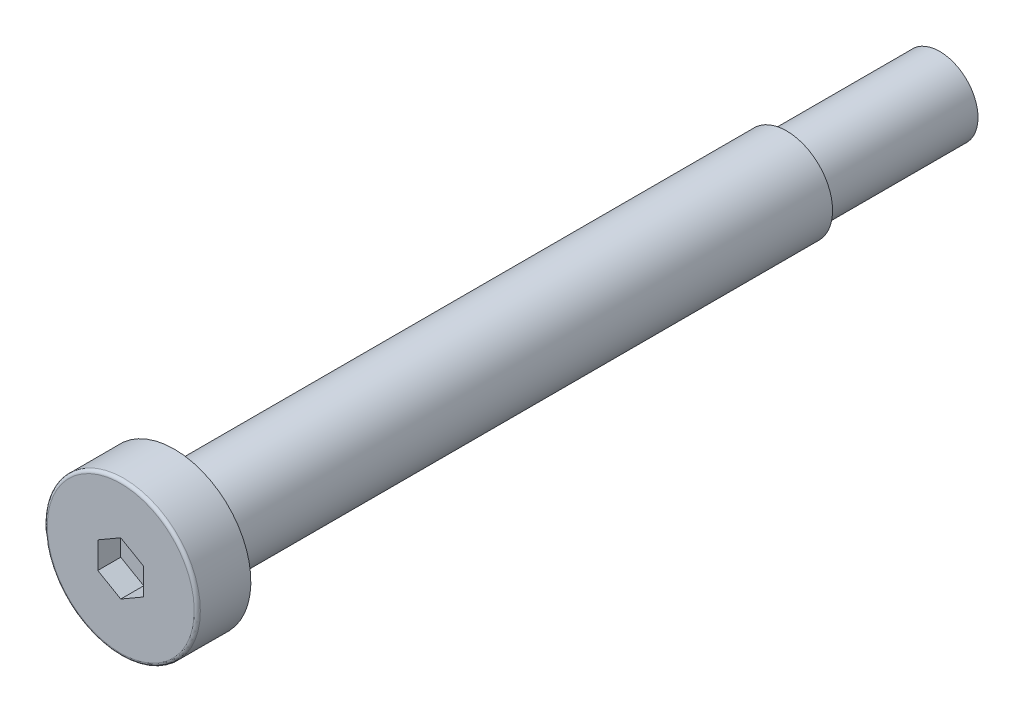
ISO-10303-21;
HEADER;
FILE_DESCRIPTION(('STEP AP214'),'2;1');
FILE_NAME('part.step','',(''),(''),'','','');
FILE_SCHEMA(('AUTOMOTIVE_DESIGN { 1 0 10303 214 1 1 1 1 }'));
ENDSEC;
DATA;
#1=APPLICATION_CONTEXT('core data for automotive mechanical design processes');
#2=APPLICATION_PROTOCOL_DEFINITION('international standard','automotive_design',2000,#1);
#3=PRODUCT_CONTEXT('',#1,'mechanical');
#4=PRODUCT('Part','Part','',(#3));
#5=PRODUCT_RELATED_PRODUCT_CATEGORY('part','',(#4));
#6=PRODUCT_DEFINITION_FORMATION('','',#4);
#7=PRODUCT_DEFINITION_CONTEXT('part definition',#1,'design');
#8=PRODUCT_DEFINITION('design','',#6,#7);
#9=PRODUCT_DEFINITION_SHAPE('','',#8);
#10=(LENGTH_UNIT() NAMED_UNIT(*) SI_UNIT(.MILLI.,.METRE.));
#11=(NAMED_UNIT(*) PLANE_ANGLE_UNIT() SI_UNIT($,.RADIAN.));
#12=(NAMED_UNIT(*) SI_UNIT($,.STERADIAN.) SOLID_ANGLE_UNIT());
#13=UNCERTAINTY_MEASURE_WITH_UNIT(LENGTH_MEASURE(1.E-05),#10,'distance_accuracy_value','');
#14=(GEOMETRIC_REPRESENTATION_CONTEXT(3) GLOBAL_UNCERTAINTY_ASSIGNED_CONTEXT((#13)) GLOBAL_UNIT_ASSIGNED_CONTEXT((#10,
#11,#12)) REPRESENTATION_CONTEXT('',''));
#15=CARTESIAN_POINT('',(0.,0.,0.));
#16=DIRECTION('',(0.,0.,1.));
#17=DIRECTION('',(1.,0.,0.));
#18=AXIS2_PLACEMENT_3D('',#15,#16,#17);
#19=CARTESIAN_POINT('',(0.,0.,0.));
#20=DIRECTION('',(0.,0.,1.));
#21=DIRECTION('',(0.,-1.,0.));
#22=AXIS2_PLACEMENT_3D('',#19,#20,#21);
#23=PLANE('',#22);
#24=CARTESIAN_POINT('',(0.,0.,0.));
#25=DIRECTION('',(0.,0.,1.));
#26=DIRECTION('',(0.,-1.,0.));
#27=AXIS2_PLACEMENT_3D('',#24,#25,#26);
#28=CIRCLE('',#27,4.79999999999999);
#29=CARTESIAN_POINT('',(0.,-4.79999999999999,0.));
#30=VERTEX_POINT('',#29);
#31=EDGE_CURVE('E11',#30,#30,#28,.T.);
#32=ORIENTED_EDGE('',*,*,#31,.T.);
#33=EDGE_LOOP('',(#32));
#34=FACE_BOUND('',#33,.T.);
#35=DIRECTION('',(0.,1.,0.));
#36=VECTOR('',#35,1.);
#37=CARTESIAN_POINT('',(1.5,-0.86602540378444,0.));
#38=LINE('',#37,#36);
#39=CARTESIAN_POINT('',(1.5,-0.86602540378444,0.));
#40=VERTEX_POINT('',#39);
#41=CARTESIAN_POINT('',(1.5,0.866025403784439,0.));
#42=VERTEX_POINT('',#41);
#43=EDGE_CURVE('E54',#40,#42,#38,.T.);
#44=ORIENTED_EDGE('',*,*,#43,.F.);
#45=DIRECTION('',(0.866025403784439,0.5,0.));
#46=VECTOR('',#45,1.);
#47=CARTESIAN_POINT('',(0.,-1.73205080756888,0.));
#48=LINE('',#47,#46);
#49=CARTESIAN_POINT('',(0.,-1.73205080756888,0.));
#50=VERTEX_POINT('',#49);
#51=EDGE_CURVE('E137',#50,#40,#48,.T.);
#52=ORIENTED_EDGE('',*,*,#51,.F.);
#53=DIRECTION('',(0.866025403784439,-0.5,0.));
#54=VECTOR('',#53,1.);
#55=CARTESIAN_POINT('',(-1.5,-0.866025403784439,0.));
#56=LINE('',#55,#54);
#57=CARTESIAN_POINT('',(-1.5,-0.866025403784439,0.));
#58=VERTEX_POINT('',#57);
#59=EDGE_CURVE('E135',#58,#50,#56,.T.);
#60=ORIENTED_EDGE('',*,*,#59,.F.);
#61=DIRECTION('',(0.,-1.,0.));
#62=VECTOR('',#61,1.);
#63=CARTESIAN_POINT('',(-1.5,0.86602540378444,0.));
#64=LINE('',#63,#62);
#65=CARTESIAN_POINT('',(-1.5,0.86602540378444,0.));
#66=VERTEX_POINT('',#65);
#67=EDGE_CURVE('E102',#66,#58,#64,.T.);
#68=ORIENTED_EDGE('',*,*,#67,.F.);
#69=DIRECTION('',(-0.866025403784439,-0.5,0.));
#70=VECTOR('',#69,1.);
#71=CARTESIAN_POINT('',(0.,1.73205080756888,0.));
#72=LINE('',#71,#70);
#73=CARTESIAN_POINT('',(0.,1.73205080756888,0.));
#74=VERTEX_POINT('',#73);
#75=EDGE_CURVE('E131',#74,#66,#72,.T.);
#76=ORIENTED_EDGE('',*,*,#75,.F.);
#77=DIRECTION('',(-0.866025403784439,0.5,0.));
#78=VECTOR('',#77,1.);
#79=CARTESIAN_POINT('',(1.5,0.866025403784439,0.));
#80=LINE('',#79,#78);
#81=EDGE_CURVE('E128',#42,#74,#80,.T.);
#82=ORIENTED_EDGE('',*,*,#81,.F.);
#83=EDGE_LOOP('',(#44,#52,#60,#68,#76,#82));
#84=FACE_BOUND('',#83,.T.);
#85=ADVANCED_FACE('F39',(#34,#84),#23,.T.);
#86=CARTESIAN_POINT('',(0.,0.,-53.5));
#87=DIRECTION('',(0.,0.,-1.));
#88=DIRECTION('',(0.,1.,0.));
#89=AXIS2_PLACEMENT_3D('',#86,#87,#88);
#90=CYLINDRICAL_SURFACE('',#89,4.99999999999999);
#91=CARTESIAN_POINT('',(0.,0.,-0.199999999999999));
#92=DIRECTION('',(0.,0.,1.));
#93=DIRECTION('',(0.,-1.,0.));
#94=AXIS2_PLACEMENT_3D('',#91,#92,#93);
#95=CIRCLE('',#94,4.99999999999999);
#96=CARTESIAN_POINT('',(0.,-4.99999999999999,-0.199999999999999));
#97=VERTEX_POINT('',#96);
#98=EDGE_CURVE('E47',#97,#97,#95,.F.);
#99=ORIENTED_EDGE('',*,*,#98,.T.);
#100=EDGE_LOOP('',(#99));
#101=FACE_BOUND('',#100,.T.);
#102=CARTESIAN_POINT('',(0.,0.,-3.5));
#103=DIRECTION('',(0.,0.,-1.));
#104=DIRECTION('',(0.,1.,0.));
#105=AXIS2_PLACEMENT_3D('',#102,#103,#104);
#106=CIRCLE('',#105,4.99999999999999);
#107=CARTESIAN_POINT('',(0.,4.99999999999999,-3.5));
#108=VERTEX_POINT('',#107);
#109=EDGE_CURVE('E158',#108,#108,#106,.T.);
#110=ORIENTED_EDGE('',*,*,#109,.F.);
#111=EDGE_LOOP('',(#110));
#112=FACE_BOUND('',#111,.T.);
#113=ADVANCED_FACE('F163',(#101,#112),#90,.T.);
#114=CARTESIAN_POINT('',(0.,4.99999999999999,-3.5));
#115=DIRECTION('',(0.,0.,-1.));
#116=DIRECTION('',(0.,1.,0.));
#117=AXIS2_PLACEMENT_3D('',#114,#115,#116);
#118=PLANE('',#117);
#119=ORIENTED_EDGE('',*,*,#109,.T.);
#120=EDGE_LOOP('',(#119));
#121=FACE_BOUND('',#120,.T.);
#122=CARTESIAN_POINT('',(0.,0.,-3.5));
#123=DIRECTION('',(0.,0.,-1.));
#124=DIRECTION('',(0.,1.,0.));
#125=AXIS2_PLACEMENT_3D('',#122,#123,#124);
#126=CIRCLE('',#125,2.99999999999999);
#127=CARTESIAN_POINT('',(0.,2.99999999999999,-3.5));
#128=VERTEX_POINT('',#127);
#129=EDGE_CURVE('E155',#128,#128,#126,.T.);
#130=ORIENTED_EDGE('',*,*,#129,.F.);
#131=EDGE_LOOP('',(#130));
#132=FACE_BOUND('',#131,.T.);
#133=ADVANCED_FACE('F179',(#121,#132),#118,.T.);
#134=CARTESIAN_POINT('',(0.,0.,-53.5));
#135=DIRECTION('',(0.,0.,-1.));
#136=DIRECTION('',(0.,1.,0.));
#137=AXIS2_PLACEMENT_3D('',#134,#135,#136);
#138=CYLINDRICAL_SURFACE('',#137,2.99999999999999);
#139=ORIENTED_EDGE('',*,*,#129,.T.);
#140=EDGE_LOOP('',(#139));
#141=FACE_BOUND('',#140,.T.);
#142=CARTESIAN_POINT('',(0.,0.,-43.5));
#143=DIRECTION('',(0.,0.,-1.));
#144=DIRECTION('',(0.,1.,0.));
#145=AXIS2_PLACEMENT_3D('',#142,#143,#144);
#146=CIRCLE('',#145,2.99999999999999);
#147=CARTESIAN_POINT('',(0.,2.99999999999999,-43.5));
#148=VERTEX_POINT('',#147);
#149=EDGE_CURVE('E152',#148,#148,#146,.T.);
#150=ORIENTED_EDGE('',*,*,#149,.F.);
#151=EDGE_LOOP('',(#150));
#152=FACE_BOUND('',#151,.T.);
#153=ADVANCED_FACE('F185',(#141,#152),#138,.T.);
#154=CARTESIAN_POINT('',(0.,2.99999999999999,-43.5));
#155=DIRECTION('',(0.,0.,-1.));
#156=DIRECTION('',(0.,1.,0.));
#157=AXIS2_PLACEMENT_3D('',#154,#155,#156);
#158=PLANE('',#157);
#159=ORIENTED_EDGE('',*,*,#149,.T.);
#160=EDGE_LOOP('',(#159));
#161=FACE_BOUND('',#160,.T.);
#162=CARTESIAN_POINT('',(0.,0.,-43.5));
#163=DIRECTION('',(0.,0.,-1.));
#164=DIRECTION('',(0.,1.,0.));
#165=AXIS2_PLACEMENT_3D('',#162,#163,#164);
#166=CIRCLE('',#165,2.5);
#167=CARTESIAN_POINT('',(0.,2.5,-43.5));
#168=VERTEX_POINT('',#167);
#169=EDGE_CURVE('E149',#168,#168,#166,.T.);
#170=ORIENTED_EDGE('',*,*,#169,.F.);
#171=EDGE_LOOP('',(#170));
#172=FACE_BOUND('',#171,.T.);
#173=ADVANCED_FACE('F189',(#161,#172),#158,.T.);
#174=CARTESIAN_POINT('',(0.,0.,-53.5));
#175=DIRECTION('',(0.,0.,-1.));
#176=DIRECTION('',(0.,1.,0.));
#177=AXIS2_PLACEMENT_3D('',#174,#175,#176);
#178=CYLINDRICAL_SURFACE('',#177,2.5);
#179=ORIENTED_EDGE('',*,*,#169,.T.);
#180=EDGE_LOOP('',(#179));
#181=FACE_BOUND('',#180,.T.);
#182=CARTESIAN_POINT('',(0.,0.,-53.5));
#183=DIRECTION('',(0.,0.,-1.));
#184=DIRECTION('',(0.,1.,0.));
#185=AXIS2_PLACEMENT_3D('',#182,#183,#184);
#186=CIRCLE('',#185,2.5);
#187=CARTESIAN_POINT('',(0.,2.5,-53.5));
#188=VERTEX_POINT('',#187);
#189=EDGE_CURVE('E141',#188,#188,#186,.T.);
#190=ORIENTED_EDGE('',*,*,#189,.F.);
#191=EDGE_LOOP('',(#190));
#192=FACE_BOUND('',#191,.T.);
#193=ADVANCED_FACE('F193',(#181,#192),#178,.T.);
#194=CARTESIAN_POINT('',(0.,2.5,-53.5));
#195=DIRECTION('',(0.,0.,-1.));
#196=DIRECTION('',(0.,1.,0.));
#197=AXIS2_PLACEMENT_3D('',#194,#195,#196);
#198=PLANE('',#197);
#199=ORIENTED_EDGE('',*,*,#189,.T.);
#200=EDGE_LOOP('',(#199));
#201=FACE_BOUND('',#200,.T.);
#202=ADVANCED_FACE('F197',(#201),#198,.T.);
#203=CARTESIAN_POINT('',(1.5,-0.86602540378444,-1.5));
#204=DIRECTION('',(1.,0.,0.));
#205=DIRECTION('',(0.,0.,-1.));
#206=AXIS2_PLACEMENT_3D('',#203,#204,#205);
#207=PLANE('',#206);
#208=ORIENTED_EDGE('',*,*,#43,.T.);
#209=DIRECTION('',(0.,0.,1.));
#210=VECTOR('',#209,1.);
#211=CARTESIAN_POINT('',(1.5,0.866025403784439,-1.5));
#212=LINE('',#211,#210);
#213=CARTESIAN_POINT('',(1.5,0.866025403784439,-1.5));
#214=VERTEX_POINT('',#213);
#215=EDGE_CURVE('E84',#214,#42,#212,.T.);
#216=ORIENTED_EDGE('',*,*,#215,.F.);
#217=DIRECTION('',(0.,1.,0.));
#218=VECTOR('',#217,1.);
#219=CARTESIAN_POINT('',(1.5,-0.86602540378444,-1.5));
#220=LINE('',#219,#218);
#221=CARTESIAN_POINT('',(1.5,-0.86602540378444,-1.5));
#222=VERTEX_POINT('',#221);
#223=EDGE_CURVE('E139',#222,#214,#220,.T.);
#224=ORIENTED_EDGE('',*,*,#223,.F.);
#225=DIRECTION('',(0.,0.,1.));
#226=VECTOR('',#225,1.);
#227=CARTESIAN_POINT('',(1.5,-0.86602540378444,-1.5));
#228=LINE('',#227,#226);
#229=EDGE_CURVE('E62',#222,#40,#228,.T.);
#230=ORIENTED_EDGE('',*,*,#229,.T.);
#231=EDGE_LOOP('',(#208,#216,#224,#230));
#232=FACE_BOUND('',#231,.T.);
#233=ADVANCED_FACE('F201',(#232),#207,.F.);
#234=CARTESIAN_POINT('',(0.,-1.73205080756888,-1.5));
#235=DIRECTION('',(0.5,-0.866025403784439,0.));
#236=DIRECTION('',(0.866025403784439,0.5,0.));
#237=AXIS2_PLACEMENT_3D('',#234,#235,#236);
#238=PLANE('',#237);
#239=ORIENTED_EDGE('',*,*,#51,.T.);
#240=ORIENTED_EDGE('',*,*,#229,.F.);
#241=DIRECTION('',(0.866025403784439,0.5,0.));
#242=VECTOR('',#241,1.);
#243=CARTESIAN_POINT('',(0.,-1.73205080756888,-1.5));
#244=LINE('',#243,#242);
#245=CARTESIAN_POINT('',(0.,-1.73205080756888,-1.5));
#246=VERTEX_POINT('',#245);
#247=EDGE_CURVE('E114',#246,#222,#244,.T.);
#248=ORIENTED_EDGE('',*,*,#247,.F.);
#249=DIRECTION('',(0.,0.,1.));
#250=VECTOR('',#249,1.);
#251=CARTESIAN_POINT('',(0.,-1.73205080756888,-1.5));
#252=LINE('',#251,#250);
#253=EDGE_CURVE('E106',#246,#50,#252,.T.);
#254=ORIENTED_EDGE('',*,*,#253,.T.);
#255=EDGE_LOOP('',(#239,#240,#248,#254));
#256=FACE_BOUND('',#255,.T.);
#257=ADVANCED_FACE('F205',(#256),#238,.F.);
#258=CARTESIAN_POINT('',(-1.5,-0.866025403784439,-1.5));
#259=DIRECTION('',(-0.5,-0.866025403784439,0.));
#260=DIRECTION('',(0.866025403784439,-0.5,0.));
#261=AXIS2_PLACEMENT_3D('',#258,#259,#260);
#262=PLANE('',#261);
#263=ORIENTED_EDGE('',*,*,#59,.T.);
#264=ORIENTED_EDGE('',*,*,#253,.F.);
#265=DIRECTION('',(0.866025403784439,-0.5,0.));
#266=VECTOR('',#265,1.);
#267=CARTESIAN_POINT('',(-1.5,-0.866025403784439,-1.5));
#268=LINE('',#267,#266);
#269=CARTESIAN_POINT('',(-1.5,-0.866025403784439,-1.5));
#270=VERTEX_POINT('',#269);
#271=EDGE_CURVE('E110',#270,#246,#268,.T.);
#272=ORIENTED_EDGE('',*,*,#271,.F.);
#273=DIRECTION('',(0.,0.,1.));
#274=VECTOR('',#273,1.);
#275=CARTESIAN_POINT('',(-1.5,-0.866025403784439,-1.5));
#276=LINE('',#275,#274);
#277=EDGE_CURVE('E95',#270,#58,#276,.T.);
#278=ORIENTED_EDGE('',*,*,#277,.T.);
#279=EDGE_LOOP('',(#263,#264,#272,#278));
#280=FACE_BOUND('',#279,.T.);
#281=ADVANCED_FACE('F111',(#280),#262,.F.);
#282=CARTESIAN_POINT('',(-1.5,0.86602540378444,-1.5));
#283=DIRECTION('',(-1.,0.,0.));
#284=DIRECTION('',(0.,0.,1.));
#285=AXIS2_PLACEMENT_3D('',#282,#283,#284);
#286=PLANE('',#285);
#287=ORIENTED_EDGE('',*,*,#67,.T.);
#288=ORIENTED_EDGE('',*,*,#277,.F.);
#289=DIRECTION('',(0.,-1.,0.));
#290=VECTOR('',#289,1.);
#291=CARTESIAN_POINT('',(-1.5,0.86602540378444,-1.5));
#292=LINE('',#291,#290);
#293=CARTESIAN_POINT('',(-1.5,0.86602540378444,-1.5));
#294=VERTEX_POINT('',#293);
#295=EDGE_CURVE('E99',#294,#270,#292,.T.);
#296=ORIENTED_EDGE('',*,*,#295,.F.);
#297=DIRECTION('',(0.,0.,1.));
#298=VECTOR('',#297,1.);
#299=CARTESIAN_POINT('',(-1.5,0.86602540378444,-1.5));
#300=LINE('',#299,#298);
#301=EDGE_CURVE('E107',#294,#66,#300,.T.);
#302=ORIENTED_EDGE('',*,*,#301,.T.);
#303=EDGE_LOOP('',(#287,#288,#296,#302));
#304=FACE_BOUND('',#303,.T.);
#305=ADVANCED_FACE('F97',(#304),#286,.F.);
#306=CARTESIAN_POINT('',(0.,1.73205080756888,-1.5));
#307=DIRECTION('',(-0.5,0.866025403784439,0.));
#308=DIRECTION('',(-0.866025403784439,-0.5,0.));
#309=AXIS2_PLACEMENT_3D('',#306,#307,#308);
#310=PLANE('',#309);
#311=ORIENTED_EDGE('',*,*,#75,.T.);
#312=ORIENTED_EDGE('',*,*,#301,.F.);
#313=DIRECTION('',(-0.866025403784439,-0.5,0.));
#314=VECTOR('',#313,1.);
#315=CARTESIAN_POINT('',(0.,1.73205080756888,-1.5));
#316=LINE('',#315,#314);
#317=CARTESIAN_POINT('',(0.,1.73205080756888,-1.5));
#318=VERTEX_POINT('',#317);
#319=EDGE_CURVE('E120',#318,#294,#316,.T.);
#320=ORIENTED_EDGE('',*,*,#319,.F.);
#321=DIRECTION('',(0.,0.,1.));
#322=VECTOR('',#321,1.);
#323=CARTESIAN_POINT('',(0.,1.73205080756888,-1.5));
#324=LINE('',#323,#322);
#325=EDGE_CURVE('E144',#318,#74,#324,.T.);
#326=ORIENTED_EDGE('',*,*,#325,.T.);
#327=EDGE_LOOP('',(#311,#312,#320,#326));
#328=FACE_BOUND('',#327,.T.);
#329=ADVANCED_FACE('F208',(#328),#310,.F.);
#330=CARTESIAN_POINT('',(1.5,0.866025403784439,-1.5));
#331=DIRECTION('',(0.5,0.866025403784438,0.));
#332=DIRECTION('',(-0.866025403784439,0.5,0.));
#333=AXIS2_PLACEMENT_3D('',#330,#331,#332);
#334=PLANE('',#333);
#335=ORIENTED_EDGE('',*,*,#81,.T.);
#336=ORIENTED_EDGE('',*,*,#325,.F.);
#337=DIRECTION('',(-0.866025403784439,0.5,0.));
#338=VECTOR('',#337,1.);
#339=CARTESIAN_POINT('',(1.5,0.866025403784439,-1.5));
#340=LINE('',#339,#338);
#341=EDGE_CURVE('E122',#214,#318,#340,.T.);
#342=ORIENTED_EDGE('',*,*,#341,.F.);
#343=ORIENTED_EDGE('',*,*,#215,.T.);
#344=EDGE_LOOP('',(#335,#336,#342,#343));
#345=FACE_BOUND('',#344,.T.);
#346=ADVANCED_FACE('F171',(#345),#334,.F.);
#347=CARTESIAN_POINT('',(0.,0.,-1.5));
#348=DIRECTION('',(0.,0.,1.));
#349=DIRECTION('',(1.,0.,0.));
#350=AXIS2_PLACEMENT_3D('',#347,#348,#349);
#351=PLANE('',#350);
#352=ORIENTED_EDGE('',*,*,#223,.T.);
#353=ORIENTED_EDGE('',*,*,#341,.T.);
#354=ORIENTED_EDGE('',*,*,#319,.T.);
#355=ORIENTED_EDGE('',*,*,#295,.T.);
#356=ORIENTED_EDGE('',*,*,#271,.T.);
#357=ORIENTED_EDGE('',*,*,#247,.T.);
#358=EDGE_LOOP('',(#352,#353,#354,#355,#356,#357));
#359=FACE_BOUND('',#358,.T.);
#360=ADVANCED_FACE('F117',(#359),#351,.T.);
#361=CARTESIAN_POINT('',(0.,0.,-0.199999999999999));
#362=DIRECTION('',(0.,0.,1.));
#363=DIRECTION('',(0.,-1.,0.));
#364=AXIS2_PLACEMENT_3D('',#361,#362,#363);
#365=TOROIDAL_SURFACE('',#364,4.79999999999999,0.2);
#366=ORIENTED_EDGE('',*,*,#31,.F.);
#367=EDGE_LOOP('',(#366));
#368=FACE_BOUND('',#367,.T.);
#369=ORIENTED_EDGE('',*,*,#98,.F.);
#370=EDGE_LOOP('',(#369));
#371=FACE_BOUND('',#370,.T.);
#372=ADVANCED_FACE('F41',(#368,#371),#365,.T.);
#373=CLOSED_SHELL('',(#85,#113,#133,#153,#173,#193,#202,#233,#257,#281,#305,#329,#346,#360,#372));
#374=MANIFOLD_SOLID_BREP('B2',#373);
#375=ADVANCED_BREP_SHAPE_REPRESENTATION('',(#18,#374),#14);
#376=SHAPE_DEFINITION_REPRESENTATION(#9,#375);
ENDSEC;
END-ISO-10303-21;
